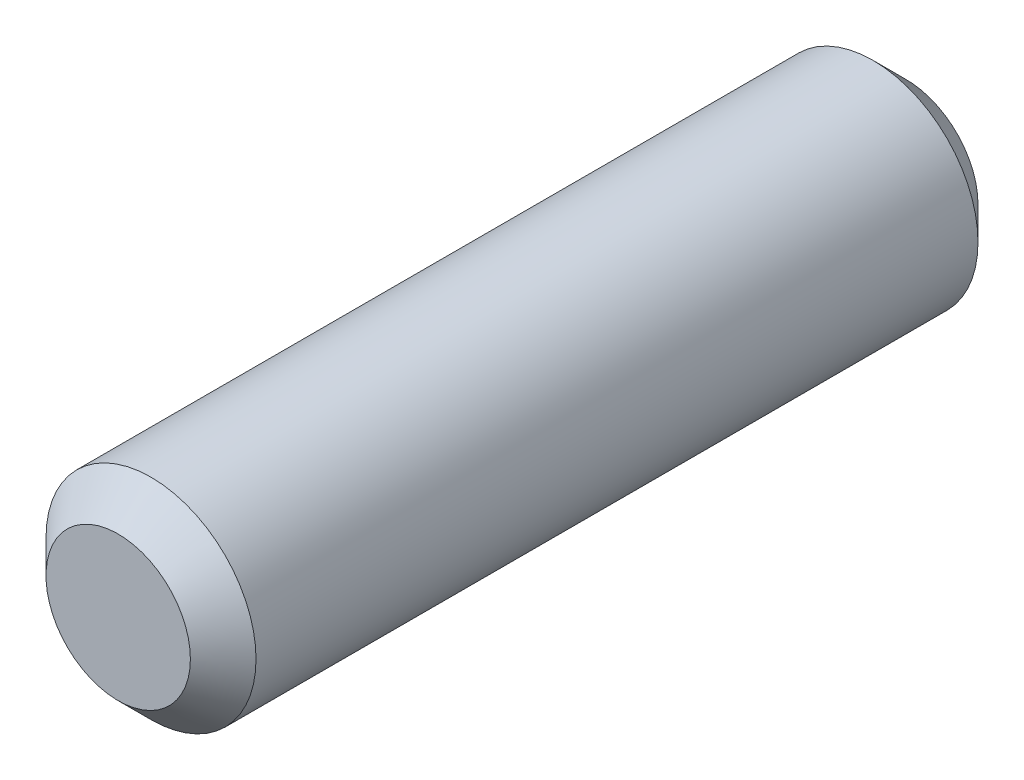
ISO-10303-21;
HEADER;
FILE_DESCRIPTION(('STEP AP214'),'2;1');
FILE_NAME('part.step','',(''),(''),'','','');
FILE_SCHEMA(('AUTOMOTIVE_DESIGN { 1 0 10303 214 1 1 1 1 }'));
ENDSEC;
DATA;
#1=APPLICATION_CONTEXT('core data for automotive mechanical design processes');
#2=APPLICATION_PROTOCOL_DEFINITION('international standard','automotive_design',2000,#1);
#3=PRODUCT_CONTEXT('',#1,'mechanical');
#4=PRODUCT('Part','Part','',(#3));
#5=PRODUCT_RELATED_PRODUCT_CATEGORY('part','',(#4));
#6=PRODUCT_DEFINITION_FORMATION('','',#4);
#7=PRODUCT_DEFINITION_CONTEXT('part definition',#1,'design');
#8=PRODUCT_DEFINITION('design','',#6,#7);
#9=PRODUCT_DEFINITION_SHAPE('','',#8);
#10=(LENGTH_UNIT() NAMED_UNIT(*) SI_UNIT(.MILLI.,.METRE.));
#11=(NAMED_UNIT(*) PLANE_ANGLE_UNIT() SI_UNIT($,.RADIAN.));
#12=(NAMED_UNIT(*) SI_UNIT($,.STERADIAN.) SOLID_ANGLE_UNIT());
#13=UNCERTAINTY_MEASURE_WITH_UNIT(LENGTH_MEASURE(1.E-05),#10,'distance_accuracy_value','');
#14=(GEOMETRIC_REPRESENTATION_CONTEXT(3) GLOBAL_UNCERTAINTY_ASSIGNED_CONTEXT((#13)) GLOBAL_UNIT_ASSIGNED_CONTEXT((#10,
#11,#12)) REPRESENTATION_CONTEXT('',''));
#15=CARTESIAN_POINT('',(0.,0.,0.));
#16=DIRECTION('',(0.,0.,1.));
#17=DIRECTION('',(1.,0.,0.));
#18=AXIS2_PLACEMENT_3D('',#15,#16,#17);
#19=CARTESIAN_POINT('',(0.,0.,6.));
#20=DIRECTION('',(0.,0.,-1.));
#21=DIRECTION('',(-1.,0.,0.));
#22=AXIS2_PLACEMENT_3D('',#19,#20,#21);
#23=CYLINDRICAL_SURFACE('',#22,0.8);
#24=CARTESIAN_POINT('',(0.,0.,0.25));
#25=DIRECTION('',(0.,0.,1.));
#26=DIRECTION('',(1.,0.,0.));
#27=AXIS2_PLACEMENT_3D('',#24,#25,#26);
#28=CIRCLE('',#27,0.8);
#29=CARTESIAN_POINT('',(0.8,0.,0.25));
#30=VERTEX_POINT('',#29);
#31=EDGE_CURVE('E59',#30,#30,#28,.T.);
#32=ORIENTED_EDGE('',*,*,#31,.T.);
#33=EDGE_LOOP('',(#32));
#34=FACE_BOUND('',#33,.T.);
#35=CARTESIAN_POINT('',(0.,0.,5.75));
#36=DIRECTION('',(0.,0.,1.));
#37=DIRECTION('',(1.,0.,0.));
#38=AXIS2_PLACEMENT_3D('',#35,#36,#37);
#39=CIRCLE('',#38,0.8);
#40=CARTESIAN_POINT('',(0.8,0.,5.75));
#41=VERTEX_POINT('',#40);
#42=EDGE_CURVE('E64',#41,#41,#39,.F.);
#43=ORIENTED_EDGE('',*,*,#42,.T.);
#44=EDGE_LOOP('',(#43));
#45=FACE_BOUND('',#44,.T.);
#46=ADVANCED_FACE('F45',(#34,#45),#23,.T.);
#47=CARTESIAN_POINT('',(0.,0.,6.));
#48=DIRECTION('',(0.,0.,1.));
#49=DIRECTION('',(1.,0.,0.));
#50=AXIS2_PLACEMENT_3D('',#47,#48,#49);
#51=PLANE('',#50);
#52=CARTESIAN_POINT('',(0.,0.,6.));
#53=DIRECTION('',(0.,0.,1.));
#54=DIRECTION('',(1.,0.,0.));
#55=AXIS2_PLACEMENT_3D('',#52,#53,#54);
#56=CIRCLE('',#55,0.549999999999999);
#57=CARTESIAN_POINT('',(0.549999999999999,0.,6.));
#58=VERTEX_POINT('',#57);
#59=EDGE_CURVE('E10',#58,#58,#56,.T.);
#60=ORIENTED_EDGE('',*,*,#59,.T.);
#61=EDGE_LOOP('',(#60));
#62=FACE_BOUND('',#61,.T.);
#63=ADVANCED_FACE('F81',(#62),#51,.T.);
#64=CARTESIAN_POINT('',(0.,0.,0.));
#65=DIRECTION('',(0.,0.,1.));
#66=DIRECTION('',(1.,0.,0.));
#67=AXIS2_PLACEMENT_3D('',#64,#65,#66);
#68=PLANE('',#67);
#69=CARTESIAN_POINT('',(0.,0.,0.));
#70=DIRECTION('',(0.,0.,1.));
#71=DIRECTION('',(1.,0.,0.));
#72=AXIS2_PLACEMENT_3D('',#69,#70,#71);
#73=CIRCLE('',#72,0.549999999999998);
#74=CARTESIAN_POINT('',(0.549999999999998,0.,0.));
#75=VERTEX_POINT('',#74);
#76=EDGE_CURVE('E54',#75,#75,#73,.F.);
#77=ORIENTED_EDGE('',*,*,#76,.T.);
#78=EDGE_LOOP('',(#77));
#79=FACE_BOUND('',#78,.T.);
#80=ADVANCED_FACE('F78',(#79),#68,.F.);
#81=CARTESIAN_POINT('',(0.,0.,0.25));
#82=DIRECTION('',(0.,0.,1.));
#83=DIRECTION('',(1.,0.,0.));
#84=AXIS2_PLACEMENT_3D('',#81,#82,#83);
#85=CONICAL_SURFACE('',#84,0.8,0.785398163397451);
#86=ORIENTED_EDGE('',*,*,#76,.F.);
#87=EDGE_LOOP('',(#86));
#88=FACE_BOUND('',#87,.T.);
#89=ORIENTED_EDGE('',*,*,#31,.F.);
#90=EDGE_LOOP('',(#89));
#91=FACE_BOUND('',#90,.T.);
#92=ADVANCED_FACE('F74',(#88,#91),#85,.T.);
#93=CARTESIAN_POINT('',(0.,0.,6.));
#94=DIRECTION('',(0.,0.,-1.));
#95=DIRECTION('',(-1.,0.,0.));
#96=AXIS2_PLACEMENT_3D('',#93,#94,#95);
#97=CONICAL_SURFACE('',#96,0.549999999999999,0.785398163397446);
#98=ORIENTED_EDGE('',*,*,#42,.F.);
#99=EDGE_LOOP('',(#98));
#100=FACE_BOUND('',#99,.T.);
#101=ORIENTED_EDGE('',*,*,#59,.F.);
#102=EDGE_LOOP('',(#101));
#103=FACE_BOUND('',#102,.T.);
#104=ADVANCED_FACE('F48',(#100,#103),#97,.T.);
#105=CLOSED_SHELL('',(#46,#63,#80,#92,#104));
#106=MANIFOLD_SOLID_BREP('B2',#105);
#107=ADVANCED_BREP_SHAPE_REPRESENTATION('',(#18,#106),#14);
#108=SHAPE_DEFINITION_REPRESENTATION(#9,#107);
ENDSEC;
END-ISO-10303-21;
